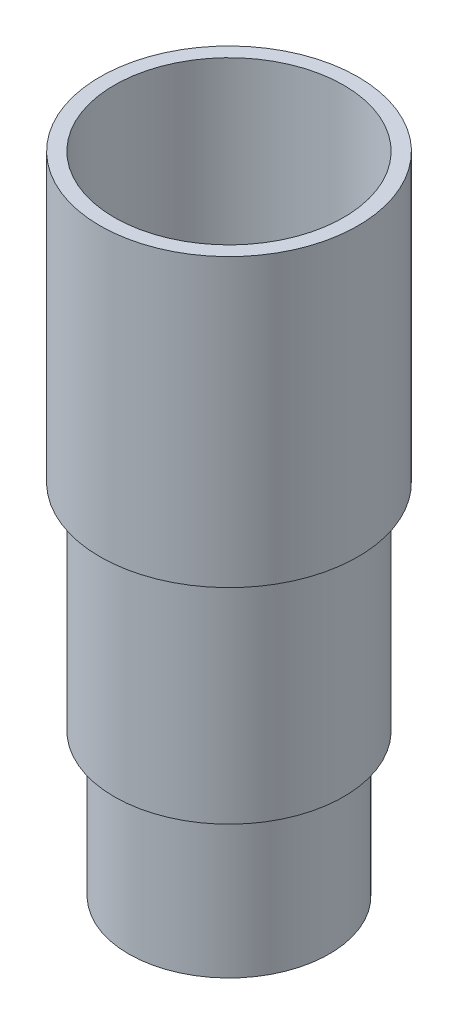
ISO-10303-21;
HEADER;
FILE_DESCRIPTION(('STEP AP214'),'2;1');
FILE_NAME('part.step','',(''),(''),'','','');
FILE_SCHEMA(('AUTOMOTIVE_DESIGN { 1 0 10303 214 1 1 1 1 }'));
ENDSEC;
DATA;
#1=APPLICATION_CONTEXT('core data for automotive mechanical design processes');
#2=APPLICATION_PROTOCOL_DEFINITION('international standard','automotive_design',2000,#1);
#3=PRODUCT_CONTEXT('',#1,'mechanical');
#4=PRODUCT('Part','Part','',(#3));
#5=PRODUCT_RELATED_PRODUCT_CATEGORY('part','',(#4));
#6=PRODUCT_DEFINITION_FORMATION('','',#4);
#7=PRODUCT_DEFINITION_CONTEXT('part definition',#1,'design');
#8=PRODUCT_DEFINITION('design','',#6,#7);
#9=PRODUCT_DEFINITION_SHAPE('','',#8);
#10=(LENGTH_UNIT() NAMED_UNIT(*) SI_UNIT(.MILLI.,.METRE.));
#11=(NAMED_UNIT(*) PLANE_ANGLE_UNIT() SI_UNIT($,.RADIAN.));
#12=(NAMED_UNIT(*) SI_UNIT($,.STERADIAN.) SOLID_ANGLE_UNIT());
#13=UNCERTAINTY_MEASURE_WITH_UNIT(LENGTH_MEASURE(1.E-05),#10,'distance_accuracy_value','');
#14=(GEOMETRIC_REPRESENTATION_CONTEXT(3) GLOBAL_UNCERTAINTY_ASSIGNED_CONTEXT((#13)) GLOBAL_UNIT_ASSIGNED_CONTEXT((#10,
#11,#12)) REPRESENTATION_CONTEXT('',''));
#15=CARTESIAN_POINT('',(0.,0.,0.));
#16=DIRECTION('',(0.,0.,1.));
#17=DIRECTION('',(1.,0.,0.));
#18=AXIS2_PLACEMENT_3D('',#15,#16,#17);
#19=CARTESIAN_POINT('',(0.,114.3,0.));
#20=DIRECTION('',(0.,1.,0.));
#21=DIRECTION('',(0.,0.,1.));
#22=AXIS2_PLACEMENT_3D('',#19,#20,#21);
#23=PLANE('',#22);
#24=CARTESIAN_POINT('',(0.,114.3,0.));
#25=DIRECTION('',(0.,1.,0.));
#26=DIRECTION('',(0.,0.,1.));
#27=AXIS2_PLACEMENT_3D('',#24,#25,#26);
#28=CIRCLE('',#27,22.86);
#29=CARTESIAN_POINT('',(0.,114.3,22.86));
#30=VERTEX_POINT('',#29);
#31=EDGE_CURVE('E11',#30,#30,#28,.T.);
#32=ORIENTED_EDGE('',*,*,#31,.T.);
#33=EDGE_LOOP('',(#32));
#34=FACE_BOUND('',#33,.T.);
#35=CARTESIAN_POINT('',(0.,114.3,0.));
#36=DIRECTION('',(0.,1.,0.));
#37=DIRECTION('',(0.,0.,1.));
#38=AXIS2_PLACEMENT_3D('',#35,#36,#37);
#39=CIRCLE('',#38,20.32);
#40=CARTESIAN_POINT('',(0.,114.3,20.32));
#41=VERTEX_POINT('',#40);
#42=EDGE_CURVE('E51',#41,#41,#39,.T.);
#43=ORIENTED_EDGE('',*,*,#42,.F.);
#44=EDGE_LOOP('',(#43));
#45=FACE_BOUND('',#44,.T.);
#46=ADVANCED_FACE('F40',(#34,#45),#23,.T.);
#47=CARTESIAN_POINT('',(0.,63.5,0.));
#48=DIRECTION('',(0.,1.,0.));
#49=DIRECTION('',(0.,0.,1.));
#50=AXIS2_PLACEMENT_3D('',#47,#48,#49);
#51=PLANE('',#50);
#52=CARTESIAN_POINT('',(0.,63.5,0.));
#53=DIRECTION('',(0.,1.,0.));
#54=DIRECTION('',(0.,0.,1.));
#55=AXIS2_PLACEMENT_3D('',#52,#53,#54);
#56=CIRCLE('',#55,22.86);
#57=CARTESIAN_POINT('',(0.,63.5,22.86));
#58=VERTEX_POINT('',#57);
#59=EDGE_CURVE('E44',#58,#58,#56,.T.);
#60=ORIENTED_EDGE('',*,*,#59,.F.);
#61=EDGE_LOOP('',(#60));
#62=FACE_BOUND('',#61,.T.);
#63=CARTESIAN_POINT('',(0.,63.5,0.));
#64=DIRECTION('',(0.,1.,0.));
#65=DIRECTION('',(0.,0.,1.));
#66=AXIS2_PLACEMENT_3D('',#63,#64,#65);
#67=CIRCLE('',#66,20.32);
#68=CARTESIAN_POINT('',(0.,63.5,20.32));
#69=VERTEX_POINT('',#68);
#70=EDGE_CURVE('E53',#69,#69,#67,.T.);
#71=ORIENTED_EDGE('',*,*,#70,.T.);
#72=EDGE_LOOP('',(#71));
#73=FACE_BOUND('',#72,.T.);
#74=ADVANCED_FACE('F63',(#62,#73),#51,.F.);
#75=CARTESIAN_POINT('',(0.,114.3,0.));
#76=DIRECTION('',(0.,-1.,0.));
#77=DIRECTION('',(0.,0.,-1.));
#78=AXIS2_PLACEMENT_3D('',#75,#76,#77);
#79=CYLINDRICAL_SURFACE('',#78,22.86);
#80=ORIENTED_EDGE('',*,*,#31,.F.);
#81=EDGE_LOOP('',(#80));
#82=FACE_BOUND('',#81,.T.);
#83=ORIENTED_EDGE('',*,*,#59,.T.);
#84=EDGE_LOOP('',(#83));
#85=FACE_BOUND('',#84,.T.);
#86=ADVANCED_FACE('F42',(#82,#85),#79,.T.);
#87=CARTESIAN_POINT('',(0.,114.3,0.));
#88=DIRECTION('',(0.,-1.,0.));
#89=DIRECTION('',(0.,0.,-1.));
#90=AXIS2_PLACEMENT_3D('',#87,#88,#89);
#91=CYLINDRICAL_SURFACE('',#90,20.32);
#92=ORIENTED_EDGE('',*,*,#42,.T.);
#93=EDGE_LOOP('',(#92));
#94=FACE_BOUND('',#93,.T.);
#95=ORIENTED_EDGE('',*,*,#70,.F.);
#96=EDGE_LOOP('',(#95));
#97=FACE_BOUND('',#96,.T.);
#98=ADVANCED_FACE('F59',(#94,#97),#91,.F.);
#99=CLOSED_SHELL('',(#46,#74,#86,#98));
#100=MANIFOLD_SOLID_BREP('B2',#99);
#101=CARTESIAN_POINT('',(0.,63.5,0.));
#102=DIRECTION('',(0.,1.,0.));
#103=DIRECTION('',(0.,0.,1.));
#104=AXIS2_PLACEMENT_3D('',#101,#102,#103);
#105=PLANE('',#104);
#106=CARTESIAN_POINT('',(0.,63.5,0.));
#107=DIRECTION('',(0.,1.,0.));
#108=DIRECTION('',(0.,0.,1.));
#109=AXIS2_PLACEMENT_3D('',#106,#107,#108);
#110=CIRCLE('',#109,20.32);
#111=CARTESIAN_POINT('',(0.,63.5,-20.32));
#112=VERTEX_POINT('',#111);
#113=EDGE_CURVE('E39',#112,#112,#110,.T.);
#114=ORIENTED_EDGE('',*,*,#113,.T.);
#115=EDGE_LOOP('',(#114));
#116=FACE_BOUND('',#115,.T.);
#117=CARTESIAN_POINT('',(0.,63.5,0.));
#118=DIRECTION('',(0.,1.,0.));
#119=DIRECTION('',(0.,0.,1.));
#120=AXIS2_PLACEMENT_3D('',#117,#118,#119);
#121=CIRCLE('',#120,17.78);
#122=CARTESIAN_POINT('',(0.,63.5,-17.78));
#123=VERTEX_POINT('',#122);
#124=EDGE_CURVE('E122',#123,#123,#121,.T.);
#125=ORIENTED_EDGE('',*,*,#124,.F.);
#126=EDGE_LOOP('',(#125));
#127=FACE_BOUND('',#126,.T.);
#128=ADVANCED_FACE('F111',(#116,#127),#105,.T.);
#129=CARTESIAN_POINT('',(0.,25.4,0.));
#130=DIRECTION('',(0.,1.,0.));
#131=DIRECTION('',(0.,0.,1.));
#132=AXIS2_PLACEMENT_3D('',#129,#130,#131);
#133=PLANE('',#132);
#134=CARTESIAN_POINT('',(0.,25.4,0.));
#135=DIRECTION('',(0.,1.,0.));
#136=DIRECTION('',(0.,0.,1.));
#137=AXIS2_PLACEMENT_3D('',#134,#135,#136);
#138=CIRCLE('',#137,20.32);
#139=CARTESIAN_POINT('',(0.,25.4,-20.32));
#140=VERTEX_POINT('',#139);
#141=EDGE_CURVE('E115',#140,#140,#138,.T.);
#142=ORIENTED_EDGE('',*,*,#141,.F.);
#143=EDGE_LOOP('',(#142));
#144=FACE_BOUND('',#143,.T.);
#145=CARTESIAN_POINT('',(0.,25.4,0.));
#146=DIRECTION('',(0.,1.,0.));
#147=DIRECTION('',(0.,0.,1.));
#148=AXIS2_PLACEMENT_3D('',#145,#146,#147);
#149=CIRCLE('',#148,17.78);
#150=CARTESIAN_POINT('',(0.,25.4,-17.78));
#151=VERTEX_POINT('',#150);
#152=EDGE_CURVE('E124',#151,#151,#149,.T.);
#153=ORIENTED_EDGE('',*,*,#152,.T.);
#154=EDGE_LOOP('',(#153));
#155=FACE_BOUND('',#154,.T.);
#156=ADVANCED_FACE('F134',(#144,#155),#133,.F.);
#157=CARTESIAN_POINT('',(0.,63.5,0.));
#158=DIRECTION('',(0.,-1.,0.));
#159=DIRECTION('',(0.,0.,-1.));
#160=AXIS2_PLACEMENT_3D('',#157,#158,#159);
#161=CYLINDRICAL_SURFACE('',#160,20.32);
#162=CARTESIAN_POINT('',(0.,63.5,-20.32));
#163=CARTESIAN_POINT('',(0.,63.103125,-20.32));
#164=CARTESIAN_POINT('',(0.,62.70625,-20.32));
#165=CARTESIAN_POINT('',(0.,61.9125,-20.32));
#166=CARTESIAN_POINT('',(0.,61.515625,-20.32));
#167=CARTESIAN_POINT('',(0.,60.721875,-20.32));
#168=CARTESIAN_POINT('',(0.,60.325,-20.32));
#169=CARTESIAN_POINT('',(0.,59.53125,-20.32));
#170=CARTESIAN_POINT('',(0.,59.134375,-20.32));
#171=CARTESIAN_POINT('',(0.,58.340625,-20.32));
#172=CARTESIAN_POINT('',(0.,57.94375,-20.32));
#173=CARTESIAN_POINT('',(0.,57.15,-20.32));
#174=CARTESIAN_POINT('',(0.,56.753125,-20.32));
#175=CARTESIAN_POINT('',(0.,55.959375,-20.32));
#176=CARTESIAN_POINT('',(0.,55.5625,-20.32));
#177=CARTESIAN_POINT('',(0.,54.76875,-20.32));
#178=CARTESIAN_POINT('',(0.,54.371875,-20.32));
#179=CARTESIAN_POINT('',(0.,53.578125,-20.32));
#180=CARTESIAN_POINT('',(0.,53.18125,-20.32));
#181=CARTESIAN_POINT('',(0.,52.3875,-20.32));
#182=CARTESIAN_POINT('',(0.,51.990625,-20.32));
#183=CARTESIAN_POINT('',(0.,51.196875,-20.32));
#184=CARTESIAN_POINT('',(0.,50.8,-20.32));
#185=CARTESIAN_POINT('',(0.,50.00625,-20.32));
#186=CARTESIAN_POINT('',(0.,49.609375,-20.32));
#187=CARTESIAN_POINT('',(0.,48.815625,-20.32));
#188=CARTESIAN_POINT('',(0.,48.41875,-20.32));
#189=CARTESIAN_POINT('',(0.,47.625,-20.32));
#190=CARTESIAN_POINT('',(0.,47.228125,-20.32));
#191=CARTESIAN_POINT('',(0.,46.434375,-20.32));
#192=CARTESIAN_POINT('',(0.,46.0375,-20.32));
#193=CARTESIAN_POINT('',(0.,45.24375,-20.32));
#194=CARTESIAN_POINT('',(0.,44.846875,-20.32));
#195=CARTESIAN_POINT('',(0.,44.053125,-20.32));
#196=CARTESIAN_POINT('',(0.,43.65625,-20.32));
#197=CARTESIAN_POINT('',(0.,42.8625,-20.32));
#198=CARTESIAN_POINT('',(0.,42.465625,-20.32));
#199=CARTESIAN_POINT('',(0.,41.671875,-20.32));
#200=CARTESIAN_POINT('',(0.,41.275,-20.32));
#201=CARTESIAN_POINT('',(0.,40.48125,-20.32));
#202=CARTESIAN_POINT('',(0.,40.084375,-20.32));
#203=CARTESIAN_POINT('',(0.,39.290625,-20.32));
#204=CARTESIAN_POINT('',(0.,38.89375,-20.32));
#205=CARTESIAN_POINT('',(0.,38.1,-20.32));
#206=CARTESIAN_POINT('',(0.,37.703125,-20.32));
#207=CARTESIAN_POINT('',(0.,36.909375,-20.32));
#208=CARTESIAN_POINT('',(0.,36.5125,-20.32));
#209=CARTESIAN_POINT('',(0.,35.71875,-20.32));
#210=CARTESIAN_POINT('',(0.,35.321875,-20.32));
#211=CARTESIAN_POINT('',(0.,34.528125,-20.32));
#212=CARTESIAN_POINT('',(0.,34.13125,-20.32));
#213=CARTESIAN_POINT('',(0.,33.3375,-20.32));
#214=CARTESIAN_POINT('',(0.,32.940625,-20.32));
#215=CARTESIAN_POINT('',(0.,32.146875,-20.32));
#216=CARTESIAN_POINT('',(0.,31.75,-20.32));
#217=CARTESIAN_POINT('',(0.,30.95625,-20.32));
#218=CARTESIAN_POINT('',(0.,30.559375,-20.32));
#219=CARTESIAN_POINT('',(0.,29.765625,-20.32));
#220=CARTESIAN_POINT('',(0.,29.36875,-20.32));
#221=CARTESIAN_POINT('',(0.,28.575,-20.32));
#222=CARTESIAN_POINT('',(0.,28.178125,-20.32));
#223=CARTESIAN_POINT('',(0.,27.384375,-20.32));
#224=CARTESIAN_POINT('',(0.,26.9875,-20.32));
#225=CARTESIAN_POINT('',(0.,26.19375,-20.32));
#226=CARTESIAN_POINT('',(0.,25.796875,-20.32));
#227=CARTESIAN_POINT('',(0.,25.4,-20.32));
#228=B_SPLINE_CURVE_WITH_KNOTS('',3,(#162,#163,#164,#165,#166,#167,#168,#169,#170,#171,#172,
#173,#174,#175,#176,#177,#178,#179,#180,#181,#182,#183,#184,#185,#186,#187,#188,#189,#190,#191,
#192,#193,#194,#195,#196,#197,#198,#199,#200,#201,#202,#203,#204,#205,#206,#207,#208,#209,#210,
#211,#212,#213,#214,#215,#216,#217,#218,#219,#220,#221,#222,#223,#224,#225,#226,#227),
.UNSPECIFIED.,.F.,.F.,(4,2,2,2,2,2,2,2,2,2,2,2,2,2,2,2,2,2,2,2,2,2,2,2,2,2,2,2,2,2,2,2,4),(0.,
1.19062499999999,2.38124999999999,3.571875,4.76249999999999,5.95312499999999,7.14374999999999,
8.33437499999999,9.52499999999999,10.715625,11.90625,13.096875,14.2875,15.478125,16.66875,
17.859375,19.05,20.240625,21.43125,22.621875,23.8125,25.003125,26.19375,27.384375,28.575,
29.765625,30.95625,32.146875,33.3375,34.528125,35.71875,36.909375,38.1),.UNSPECIFIED.);
#229=EDGE_CURVE('BSEAM113',#112,#140,#228,.T.);
#230=ORIENTED_EDGE('',*,*,#113,.F.);
#231=ORIENTED_EDGE('',*,*,#141,.T.);
#232=ORIENTED_EDGE('',*,*,#229,.T.);
#233=ORIENTED_EDGE('',*,*,#229,.F.);
#234=EDGE_LOOP('',(#230,#232,#231,#233));
#235=FACE_BOUND('',#234,.T.);
#236=ADVANCED_FACE('F113',(#235),#161,.T.);
#237=CARTESIAN_POINT('',(0.,63.5,0.));
#238=DIRECTION('',(0.,-1.,0.));
#239=DIRECTION('',(0.,0.,-1.));
#240=AXIS2_PLACEMENT_3D('',#237,#238,#239);
#241=CYLINDRICAL_SURFACE('',#240,17.78);
#242=CARTESIAN_POINT('',(0.,63.5,-17.78));
#243=CARTESIAN_POINT('',(0.,63.103125,-17.78));
#244=CARTESIAN_POINT('',(0.,62.70625,-17.78));
#245=CARTESIAN_POINT('',(0.,61.9125,-17.78));
#246=CARTESIAN_POINT('',(0.,61.515625,-17.78));
#247=CARTESIAN_POINT('',(0.,60.721875,-17.78));
#248=CARTESIAN_POINT('',(0.,60.325,-17.78));
#249=CARTESIAN_POINT('',(0.,59.53125,-17.78));
#250=CARTESIAN_POINT('',(0.,59.134375,-17.78));
#251=CARTESIAN_POINT('',(0.,58.340625,-17.78));
#252=CARTESIAN_POINT('',(0.,57.94375,-17.78));
#253=CARTESIAN_POINT('',(0.,57.15,-17.78));
#254=CARTESIAN_POINT('',(0.,56.753125,-17.78));
#255=CARTESIAN_POINT('',(0.,55.959375,-17.78));
#256=CARTESIAN_POINT('',(0.,55.5625,-17.78));
#257=CARTESIAN_POINT('',(0.,54.76875,-17.78));
#258=CARTESIAN_POINT('',(0.,54.371875,-17.78));
#259=CARTESIAN_POINT('',(0.,53.578125,-17.78));
#260=CARTESIAN_POINT('',(0.,53.18125,-17.78));
#261=CARTESIAN_POINT('',(0.,52.3875,-17.78));
#262=CARTESIAN_POINT('',(0.,51.990625,-17.78));
#263=CARTESIAN_POINT('',(0.,51.196875,-17.78));
#264=CARTESIAN_POINT('',(0.,50.8,-17.78));
#265=CARTESIAN_POINT('',(0.,50.00625,-17.78));
#266=CARTESIAN_POINT('',(0.,49.609375,-17.78));
#267=CARTESIAN_POINT('',(0.,48.815625,-17.78));
#268=CARTESIAN_POINT('',(0.,48.41875,-17.78));
#269=CARTESIAN_POINT('',(0.,47.625,-17.78));
#270=CARTESIAN_POINT('',(0.,47.228125,-17.78));
#271=CARTESIAN_POINT('',(0.,46.434375,-17.78));
#272=CARTESIAN_POINT('',(0.,46.0375,-17.78));
#273=CARTESIAN_POINT('',(0.,45.24375,-17.78));
#274=CARTESIAN_POINT('',(0.,44.846875,-17.78));
#275=CARTESIAN_POINT('',(0.,44.053125,-17.78));
#276=CARTESIAN_POINT('',(0.,43.65625,-17.78));
#277=CARTESIAN_POINT('',(0.,42.8625,-17.78));
#278=CARTESIAN_POINT('',(0.,42.465625,-17.78));
#279=CARTESIAN_POINT('',(0.,41.671875,-17.78));
#280=CARTESIAN_POINT('',(0.,41.275,-17.78));
#281=CARTESIAN_POINT('',(0.,40.48125,-17.78));
#282=CARTESIAN_POINT('',(0.,40.084375,-17.78));
#283=CARTESIAN_POINT('',(0.,39.290625,-17.78));
#284=CARTESIAN_POINT('',(0.,38.89375,-17.78));
#285=CARTESIAN_POINT('',(0.,38.1,-17.78));
#286=CARTESIAN_POINT('',(0.,37.703125,-17.78));
#287=CARTESIAN_POINT('',(0.,36.909375,-17.78));
#288=CARTESIAN_POINT('',(0.,36.5125,-17.78));
#289=CARTESIAN_POINT('',(0.,35.71875,-17.78));
#290=CARTESIAN_POINT('',(0.,35.321875,-17.78));
#291=CARTESIAN_POINT('',(0.,34.528125,-17.78));
#292=CARTESIAN_POINT('',(0.,34.13125,-17.78));
#293=CARTESIAN_POINT('',(0.,33.3375,-17.78));
#294=CARTESIAN_POINT('',(0.,32.940625,-17.78));
#295=CARTESIAN_POINT('',(0.,32.146875,-17.78));
#296=CARTESIAN_POINT('',(0.,31.75,-17.78));
#297=CARTESIAN_POINT('',(0.,30.95625,-17.78));
#298=CARTESIAN_POINT('',(0.,30.559375,-17.78));
#299=CARTESIAN_POINT('',(0.,29.765625,-17.78));
#300=CARTESIAN_POINT('',(0.,29.36875,-17.78));
#301=CARTESIAN_POINT('',(0.,28.575,-17.78));
#302=CARTESIAN_POINT('',(0.,28.178125,-17.78));
#303=CARTESIAN_POINT('',(0.,27.384375,-17.78));
#304=CARTESIAN_POINT('',(0.,26.9875,-17.78));
#305=CARTESIAN_POINT('',(0.,26.19375,-17.78));
#306=CARTESIAN_POINT('',(0.,25.796875,-17.78));
#307=CARTESIAN_POINT('',(0.,25.4,-17.78));
#308=B_SPLINE_CURVE_WITH_KNOTS('',3,(#242,#243,#244,#245,#246,#247,#248,#249,#250,#251,#252,
#253,#254,#255,#256,#257,#258,#259,#260,#261,#262,#263,#264,#265,#266,#267,#268,#269,#270,#271,
#272,#273,#274,#275,#276,#277,#278,#279,#280,#281,#282,#283,#284,#285,#286,#287,#288,#289,#290,
#291,#292,#293,#294,#295,#296,#297,#298,#299,#300,#301,#302,#303,#304,#305,#306,#307),
.UNSPECIFIED.,.F.,.F.,(4,2,2,2,2,2,2,2,2,2,2,2,2,2,2,2,2,2,2,2,2,2,2,2,2,2,2,2,2,2,2,2,4),(0.,
1.19062499999999,2.38124999999999,3.571875,4.76249999999999,5.95312499999999,7.14374999999999,
8.33437499999999,9.52499999999999,10.715625,11.90625,13.096875,14.2875,15.478125,16.66875,
17.859375,19.05,20.240625,21.43125,22.621875,23.8125,25.003125,26.19375,27.384375,28.575,
29.765625,30.95625,32.146875,33.3375,34.528125,35.71875,36.909375,38.1),.UNSPECIFIED.);
#309=EDGE_CURVE('BSEAM130',#123,#151,#308,.T.);
#310=ORIENTED_EDGE('',*,*,#124,.T.);
#311=ORIENTED_EDGE('',*,*,#152,.F.);
#312=ORIENTED_EDGE('',*,*,#309,.T.);
#313=ORIENTED_EDGE('',*,*,#309,.F.);
#314=EDGE_LOOP('',(#310,#312,#311,#313));
#315=FACE_BOUND('',#314,.T.);
#316=ADVANCED_FACE('F130',(#315),#241,.F.);
#317=CLOSED_SHELL('',(#128,#156,#236,#316));
#318=MANIFOLD_SOLID_BREP('B6',#317);
#319=CARTESIAN_POINT('',(0.,6.35,0.));
#320=DIRECTION('',(0.,1.,0.));
#321=DIRECTION('',(0.,0.,1.));
#322=AXIS2_PLACEMENT_3D('',#319,#320,#321);
#323=PLANE('',#322);
#324=CARTESIAN_POINT('',(0.,6.35,0.));
#325=DIRECTION('',(0.,1.,0.));
#326=DIRECTION('',(0.,0.,1.));
#327=AXIS2_PLACEMENT_3D('',#324,#325,#326);
#328=CIRCLE('',#327,15.24);
#329=CARTESIAN_POINT('',(0.,6.35,15.24));
#330=VERTEX_POINT('',#329);
#331=EDGE_CURVE('E237',#330,#330,#328,.F.);
#332=ORIENTED_EDGE('',*,*,#331,.F.);
#333=EDGE_LOOP('',(#332));
#334=FACE_BOUND('',#333,.T.);
#335=DIRECTION('',(-1.,0.,0.));
#336=VECTOR('',#335,1.);
#337=CARTESIAN_POINT('',(-10.16,6.35,-6.35));
#338=LINE('',#337,#336);
#339=CARTESIAN_POINT('',(10.16,6.35,-6.35));
#340=VERTEX_POINT('',#339);
#341=CARTESIAN_POINT('',(-10.16,6.35,-6.35));
#342=VERTEX_POINT('',#341);
#343=EDGE_CURVE('E220',#340,#342,#338,.T.);
#344=ORIENTED_EDGE('',*,*,#343,.F.);
#345=DIRECTION('',(0.,0.,-1.));
#346=VECTOR('',#345,1.);
#347=CARTESIAN_POINT('',(10.16,6.35,6.35));
#348=LINE('',#347,#346);
#349=CARTESIAN_POINT('',(10.16,6.35,6.35));
#350=VERTEX_POINT('',#349);
#351=EDGE_CURVE('E213',#350,#340,#348,.T.);
#352=ORIENTED_EDGE('',*,*,#351,.F.);
#353=DIRECTION('',(1.,0.,0.));
#354=VECTOR('',#353,1.);
#355=CARTESIAN_POINT('',(-10.16,6.35,6.35));
#356=LINE('',#355,#354);
#357=CARTESIAN_POINT('',(-10.16,6.35,6.35));
#358=VERTEX_POINT('',#357);
#359=EDGE_CURVE('E231',#358,#350,#356,.T.);
#360=ORIENTED_EDGE('',*,*,#359,.F.);
#361=DIRECTION('',(0.,0.,1.));
#362=VECTOR('',#361,1.);
#363=CARTESIAN_POINT('',(-10.16,6.35,6.35));
#364=LINE('',#363,#362);
#365=EDGE_CURVE('E229',#342,#358,#364,.T.);
#366=ORIENTED_EDGE('',*,*,#365,.F.);
#367=EDGE_LOOP('',(#344,#352,#360,#366));
#368=FACE_BOUND('',#367,.T.);
#369=ADVANCED_FACE('F173',(#334,#368),#323,.T.);
#370=CARTESIAN_POINT('',(0.,0.,0.));
#371=DIRECTION('',(0.,1.,0.));
#372=DIRECTION('',(0.,0.,1.));
#373=AXIS2_PLACEMENT_3D('',#370,#371,#372);
#374=PLANE('',#373);
#375=DIRECTION('',(0.,0.,-1.));
#376=VECTOR('',#375,1.);
#377=CARTESIAN_POINT('',(10.16,0.,6.35));
#378=LINE('',#377,#376);
#379=CARTESIAN_POINT('',(10.16,0.,6.35));
#380=VERTEX_POINT('',#379);
#381=CARTESIAN_POINT('',(10.16,0.,-6.35));
#382=VERTEX_POINT('',#381);
#383=EDGE_CURVE('E195',#380,#382,#378,.T.);
#384=ORIENTED_EDGE('',*,*,#383,.T.);
#385=DIRECTION('',(-1.,0.,0.));
#386=VECTOR('',#385,1.);
#387=CARTESIAN_POINT('',(-10.16,0.,-6.35));
#388=LINE('',#387,#386);
#389=CARTESIAN_POINT('',(-10.16,0.,-6.35));
#390=VERTEX_POINT('',#389);
#391=EDGE_CURVE('E227',#382,#390,#388,.T.);
#392=ORIENTED_EDGE('',*,*,#391,.T.);
#393=DIRECTION('',(0.,0.,1.));
#394=VECTOR('',#393,1.);
#395=CARTESIAN_POINT('',(-10.16,0.,6.35));
#396=LINE('',#395,#394);
#397=CARTESIAN_POINT('',(-10.16,0.,6.35));
#398=VERTEX_POINT('',#397);
#399=EDGE_CURVE('E239',#390,#398,#396,.T.);
#400=ORIENTED_EDGE('',*,*,#399,.T.);
#401=DIRECTION('',(1.,0.,0.));
#402=VECTOR('',#401,1.);
#403=CARTESIAN_POINT('',(-10.16,0.,6.35));
#404=LINE('',#403,#402);
#405=EDGE_CURVE('E221',#398,#380,#404,.T.);
#406=ORIENTED_EDGE('',*,*,#405,.T.);
#407=EDGE_LOOP('',(#384,#392,#400,#406));
#408=FACE_BOUND('',#407,.T.);
#409=CARTESIAN_POINT('',(0.,0.,0.));
#410=DIRECTION('',(0.,1.,0.));
#411=DIRECTION('',(0.,0.,1.));
#412=AXIS2_PLACEMENT_3D('',#409,#410,#411);
#413=CIRCLE('',#412,17.78);
#414=CARTESIAN_POINT('',(0.,0.,17.78));
#415=VERTEX_POINT('',#414);
#416=EDGE_CURVE('E326',#415,#415,#413,.T.);
#417=ORIENTED_EDGE('',*,*,#416,.F.);
#418=EDGE_LOOP('',(#417));
#419=FACE_BOUND('',#418,.T.);
#420=ADVANCED_FACE('F175',(#408,#419),#374,.F.);
#421=CARTESIAN_POINT('',(10.16,6.35,6.35));
#422=DIRECTION('',(-1.,0.,0.));
#423=DIRECTION('',(0.,0.,1.));
#424=AXIS2_PLACEMENT_3D('',#421,#422,#423);
#425=PLANE('',#424);
#426=ORIENTED_EDGE('',*,*,#383,.F.);
#427=DIRECTION('',(0.,-1.,0.));
#428=VECTOR('',#427,1.);
#429=CARTESIAN_POINT('',(10.16,6.35,6.35));
#430=LINE('',#429,#428);
#431=EDGE_CURVE('E216',#350,#380,#430,.T.);
#432=ORIENTED_EDGE('',*,*,#431,.F.);
#433=ORIENTED_EDGE('',*,*,#351,.T.);
#434=DIRECTION('',(0.,-1.,0.));
#435=VECTOR('',#434,1.);
#436=CARTESIAN_POINT('',(10.16,6.35,-6.35));
#437=LINE('',#436,#435);
#438=EDGE_CURVE('E109',#340,#382,#437,.T.);
#439=ORIENTED_EDGE('',*,*,#438,.T.);
#440=EDGE_LOOP('',(#426,#432,#433,#439));
#441=FACE_BOUND('',#440,.T.);
#442=ADVANCED_FACE('F215',(#441),#425,.T.);
#443=CARTESIAN_POINT('',(-10.16,6.35,-6.35));
#444=DIRECTION('',(0.,0.,1.));
#445=DIRECTION('',(1.,0.,0.));
#446=AXIS2_PLACEMENT_3D('',#443,#444,#445);
#447=PLANE('',#446);
#448=ORIENTED_EDGE('',*,*,#391,.F.);
#449=ORIENTED_EDGE('',*,*,#438,.F.);
#450=ORIENTED_EDGE('',*,*,#343,.T.);
#451=DIRECTION('',(0.,-1.,0.));
#452=VECTOR('',#451,1.);
#453=CARTESIAN_POINT('',(-10.16,6.35,-6.35));
#454=LINE('',#453,#452);
#455=EDGE_CURVE('E181',#342,#390,#454,.T.);
#456=ORIENTED_EDGE('',*,*,#455,.T.);
#457=EDGE_LOOP('',(#448,#449,#450,#456));
#458=FACE_BOUND('',#457,.T.);
#459=ADVANCED_FACE('F224',(#458),#447,.T.);
#460=CARTESIAN_POINT('',(-10.16,6.35,6.35));
#461=DIRECTION('',(1.,0.,0.));
#462=DIRECTION('',(0.,0.,-1.));
#463=AXIS2_PLACEMENT_3D('',#460,#461,#462);
#464=PLANE('',#463);
#465=ORIENTED_EDGE('',*,*,#399,.F.);
#466=ORIENTED_EDGE('',*,*,#455,.F.);
#467=ORIENTED_EDGE('',*,*,#365,.T.);
#468=DIRECTION('',(0.,-1.,0.));
#469=VECTOR('',#468,1.);
#470=CARTESIAN_POINT('',(-10.16,6.35,6.35));
#471=LINE('',#470,#469);
#472=EDGE_CURVE('E188',#358,#398,#471,.T.);
#473=ORIENTED_EDGE('',*,*,#472,.T.);
#474=EDGE_LOOP('',(#465,#466,#467,#473));
#475=FACE_BOUND('',#474,.T.);
#476=ADVANCED_FACE('F247',(#475),#464,.T.);
#477=CARTESIAN_POINT('',(-10.16,6.35,6.35));
#478=DIRECTION('',(0.,0.,-1.));
#479=DIRECTION('',(-1.,0.,0.));
#480=AXIS2_PLACEMENT_3D('',#477,#478,#479);
#481=PLANE('',#480);
#482=ORIENTED_EDGE('',*,*,#405,.F.);
#483=ORIENTED_EDGE('',*,*,#472,.F.);
#484=ORIENTED_EDGE('',*,*,#359,.T.);
#485=ORIENTED_EDGE('',*,*,#431,.T.);
#486=EDGE_LOOP('',(#482,#483,#484,#485));
#487=FACE_BOUND('',#486,.T.);
#488=ADVANCED_FACE('F250',(#487),#481,.T.);
#489=CARTESIAN_POINT('',(0.,25.4,0.));
#490=DIRECTION('',(0.,1.,0.));
#491=DIRECTION('',(0.,0.,1.));
#492=AXIS2_PLACEMENT_3D('',#489,#490,#491);
#493=PLANE('',#492);
#494=CARTESIAN_POINT('',(0.,25.4,0.));
#495=DIRECTION('',(0.,1.,0.));
#496=DIRECTION('',(0.,0.,1.));
#497=AXIS2_PLACEMENT_3D('',#494,#495,#496);
#498=CIRCLE('',#497,17.78);
#499=CARTESIAN_POINT('',(0.,25.4,17.78));
#500=VERTEX_POINT('',#499);
#501=EDGE_CURVE('E329',#500,#500,#498,.T.);
#502=ORIENTED_EDGE('',*,*,#501,.T.);
#503=EDGE_LOOP('',(#502));
#504=FACE_BOUND('',#503,.T.);
#505=CARTESIAN_POINT('',(0.,25.4,0.));
#506=DIRECTION('',(0.,1.,0.));
#507=DIRECTION('',(0.,0.,1.));
#508=AXIS2_PLACEMENT_3D('',#505,#506,#507);
#509=CIRCLE('',#508,15.24);
#510=CARTESIAN_POINT('',(0.,25.4,15.24));
#511=VERTEX_POINT('',#510);
#512=EDGE_CURVE('E324',#511,#511,#509,.T.);
#513=ORIENTED_EDGE('',*,*,#512,.F.);
#514=EDGE_LOOP('',(#513));
#515=FACE_BOUND('',#514,.T.);
#516=ADVANCED_FACE('F252',(#504,#515),#493,.T.);
#517=CARTESIAN_POINT('',(0.,25.4,0.));
#518=DIRECTION('',(0.,-1.,0.));
#519=DIRECTION('',(0.,0.,-1.));
#520=AXIS2_PLACEMENT_3D('',#517,#518,#519);
#521=CYLINDRICAL_SURFACE('',#520,17.78);
#522=ORIENTED_EDGE('',*,*,#501,.F.);
#523=EDGE_LOOP('',(#522));
#524=FACE_BOUND('',#523,.T.);
#525=ORIENTED_EDGE('',*,*,#416,.T.);
#526=EDGE_LOOP('',(#525));
#527=FACE_BOUND('',#526,.T.);
#528=ADVANCED_FACE('F258',(#524,#527),#521,.T.);
#529=CARTESIAN_POINT('',(0.,25.4,0.));
#530=DIRECTION('',(0.,-1.,0.));
#531=DIRECTION('',(0.,0.,-1.));
#532=AXIS2_PLACEMENT_3D('',#529,#530,#531);
#533=CYLINDRICAL_SURFACE('',#532,15.24);
#534=ORIENTED_EDGE('',*,*,#331,.T.);
#535=EDGE_LOOP('',(#534));
#536=FACE_BOUND('',#535,.T.);
#537=ORIENTED_EDGE('',*,*,#512,.T.);
#538=EDGE_LOOP('',(#537));
#539=FACE_BOUND('',#538,.T.);
#540=ADVANCED_FACE('F307',(#536,#539),#533,.F.);
#541=CLOSED_SHELL('',(#369,#420,#442,#459,#476,#488,#516,#528,#540));
#542=MANIFOLD_SOLID_BREP('B34',#541);
#543=ADVANCED_BREP_SHAPE_REPRESENTATION('',(#18,#100,#318,#542),#14);
#544=SHAPE_DEFINITION_REPRESENTATION(#9,#543);
ENDSEC;
END-ISO-10303-21;
